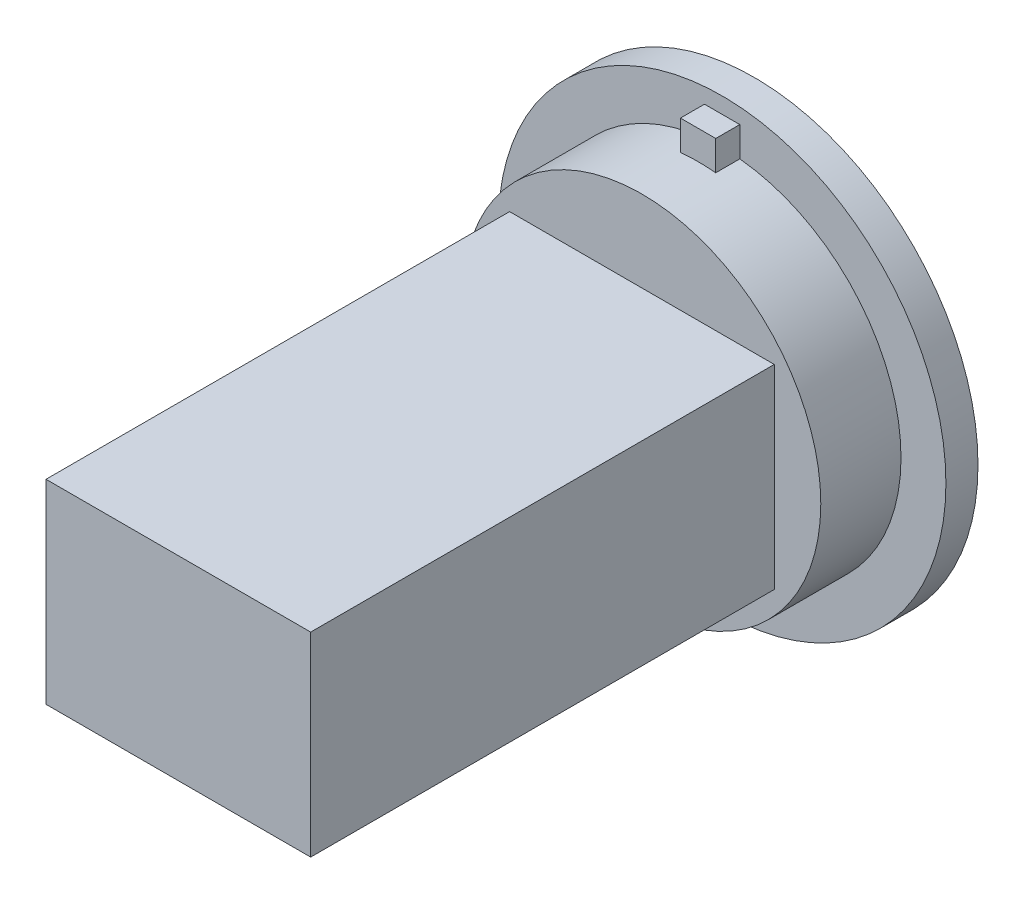
ISO-10303-21;
HEADER;
FILE_DESCRIPTION(('STEP AP214'),'2;1');
FILE_NAME('part.step','',(''),(''),'','','');
FILE_SCHEMA(('AUTOMOTIVE_DESIGN { 1 0 10303 214 1 1 1 1 }'));
ENDSEC;
DATA;
#1=APPLICATION_CONTEXT('core data for automotive mechanical design processes');
#2=APPLICATION_PROTOCOL_DEFINITION('international standard','automotive_design',2000,#1);
#3=PRODUCT_CONTEXT('',#1,'mechanical');
#4=PRODUCT('Part','Part','',(#3));
#5=PRODUCT_RELATED_PRODUCT_CATEGORY('part','',(#4));
#6=PRODUCT_DEFINITION_FORMATION('','',#4);
#7=PRODUCT_DEFINITION_CONTEXT('part definition',#1,'design');
#8=PRODUCT_DEFINITION('design','',#6,#7);
#9=PRODUCT_DEFINITION_SHAPE('','',#8);
#10=(LENGTH_UNIT() NAMED_UNIT(*) SI_UNIT(.MILLI.,.METRE.));
#11=(NAMED_UNIT(*) PLANE_ANGLE_UNIT() SI_UNIT($,.RADIAN.));
#12=(NAMED_UNIT(*) SI_UNIT($,.STERADIAN.) SOLID_ANGLE_UNIT());
#13=UNCERTAINTY_MEASURE_WITH_UNIT(LENGTH_MEASURE(1.E-05),#10,'distance_accuracy_value','');
#14=(GEOMETRIC_REPRESENTATION_CONTEXT(3) GLOBAL_UNCERTAINTY_ASSIGNED_CONTEXT((#13)) GLOBAL_UNIT_ASSIGNED_CONTEXT((#10,
#11,#12)) REPRESENTATION_CONTEXT('',''));
#15=CARTESIAN_POINT('',(0.,0.,0.));
#16=DIRECTION('',(0.,0.,1.));
#17=DIRECTION('',(1.,0.,0.));
#18=AXIS2_PLACEMENT_3D('',#15,#16,#17);
#19=CARTESIAN_POINT('',(0.,0.,2.));
#20=DIRECTION('',(0.,0.,-1.));
#21=DIRECTION('',(-1.,0.,0.));
#22=AXIS2_PLACEMENT_3D('',#19,#20,#21);
#23=CYLINDRICAL_SURFACE('',#22,13.95);
#24=CARTESIAN_POINT('',(0.,0.,2.));
#25=DIRECTION('',(0.,0.,1.));
#26=DIRECTION('',(1.,0.,0.));
#27=AXIS2_PLACEMENT_3D('',#24,#25,#26);
#28=CIRCLE('',#27,13.95);
#29=CARTESIAN_POINT('',(13.95,0.,2.));
#30=VERTEX_POINT('',#29);
#31=EDGE_CURVE('E44',#30,#30,#28,.T.);
#32=ORIENTED_EDGE('',*,*,#31,.F.);
#33=EDGE_LOOP('',(#32));
#34=FACE_BOUND('',#33,.T.);
#35=CARTESIAN_POINT('',(0.,0.,0.));
#36=DIRECTION('',(0.,0.,1.));
#37=DIRECTION('',(1.,0.,0.));
#38=AXIS2_PLACEMENT_3D('',#35,#36,#37);
#39=CIRCLE('',#38,13.95);
#40=CARTESIAN_POINT('',(13.95,0.,0.));
#41=VERTEX_POINT('',#40);
#42=EDGE_CURVE('E39',#41,#41,#39,.T.);
#43=ORIENTED_EDGE('',*,*,#42,.T.);
#44=EDGE_LOOP('',(#43));
#45=FACE_BOUND('',#44,.T.);
#46=ADVANCED_FACE('F36',(#34,#45),#23,.T.);
#47=CARTESIAN_POINT('',(0.,0.,2.));
#48=DIRECTION('',(0.,0.,1.));
#49=DIRECTION('',(1.,0.,0.));
#50=AXIS2_PLACEMENT_3D('',#47,#48,#49);
#51=PLANE('',#50);
#52=DIRECTION('',(0.,1.,0.));
#53=VECTOR('',#52,1.);
#54=CARTESIAN_POINT('',(-1.1,0.,2.));
#55=LINE('',#54,#53);
#56=CARTESIAN_POINT('',(-1.1,11.0956072389032,2.));
#57=VERTEX_POINT('',#56);
#58=CARTESIAN_POINT('',(-1.1,12.95,2.));
#59=VERTEX_POINT('',#58);
#60=EDGE_CURVE('E265',#57,#59,#55,.T.);
#61=ORIENTED_EDGE('',*,*,#60,.T.);
#62=DIRECTION('',(1.,0.,0.));
#63=VECTOR('',#62,1.);
#64=CARTESIAN_POINT('',(0.,12.95,2.));
#65=LINE('',#64,#63);
#66=CARTESIAN_POINT('',(1.1,12.95,2.));
#67=VERTEX_POINT('',#66);
#68=EDGE_CURVE('E250',#59,#67,#65,.T.);
#69=ORIENTED_EDGE('',*,*,#68,.T.);
#70=DIRECTION('',(0.,1.,0.));
#71=VECTOR('',#70,1.);
#72=CARTESIAN_POINT('',(1.1,0.,2.));
#73=LINE('',#72,#71);
#74=CARTESIAN_POINT('',(1.1,11.0956072389032,2.));
#75=VERTEX_POINT('',#74);
#76=EDGE_CURVE('E255',#75,#67,#73,.T.);
#77=ORIENTED_EDGE('',*,*,#76,.F.);
#78=CARTESIAN_POINT('',(0.,0.,2.));
#79=DIRECTION('',(0.,0.,1.));
#80=DIRECTION('',(1.,0.,0.));
#81=AXIS2_PLACEMENT_3D('',#78,#79,#80);
#82=CIRCLE('',#81,11.15);
#83=EDGE_CURVE('E11',#57,#75,#82,.T.);
#84=ORIENTED_EDGE('',*,*,#83,.F.);
#85=EDGE_LOOP('',(#61,#69,#77,#84));
#86=FACE_BOUND('',#85,.T.);
#87=ORIENTED_EDGE('',*,*,#31,.T.);
#88=EDGE_LOOP('',(#87));
#89=FACE_BOUND('',#88,.T.);
#90=ADVANCED_FACE('F290',(#86,#89),#51,.T.);
#91=CARTESIAN_POINT('',(0.,0.,0.));
#92=DIRECTION('',(0.,0.,1.));
#93=DIRECTION('',(1.,0.,0.));
#94=AXIS2_PLACEMENT_3D('',#91,#92,#93);
#95=PLANE('',#94);
#96=DIRECTION('',(1.,0.,0.));
#97=VECTOR('',#96,1.);
#98=CARTESIAN_POINT('',(-6.,4.,0.));
#99=LINE('',#98,#97);
#100=CARTESIAN_POINT('',(-6.,4.,0.));
#101=VERTEX_POINT('',#100);
#102=CARTESIAN_POINT('',(-1.5,4.,0.));
#103=VERTEX_POINT('',#102);
#104=EDGE_CURVE('E191',#101,#103,#99,.T.);
#105=ORIENTED_EDGE('',*,*,#104,.F.);
#106=DIRECTION('',(0.,1.,0.));
#107=VECTOR('',#106,1.);
#108=CARTESIAN_POINT('',(-6.,-4.,0.));
#109=LINE('',#108,#107);
#110=CARTESIAN_POINT('',(-6.,-4.,0.));
#111=VERTEX_POINT('',#110);
#112=EDGE_CURVE('E52',#111,#101,#109,.T.);
#113=ORIENTED_EDGE('',*,*,#112,.F.);
#114=DIRECTION('',(-1.,0.,0.));
#115=VECTOR('',#114,1.);
#116=CARTESIAN_POINT('',(-6.,-4.,0.));
#117=LINE('',#116,#115);
#118=CARTESIAN_POINT('',(6.,-4.,0.));
#119=VERTEX_POINT('',#118);
#120=EDGE_CURVE('E171',#119,#111,#117,.T.);
#121=ORIENTED_EDGE('',*,*,#120,.F.);
#122=DIRECTION('',(0.,-1.,0.));
#123=VECTOR('',#122,1.);
#124=CARTESIAN_POINT('',(6.,-4.,0.));
#125=LINE('',#124,#123);
#126=CARTESIAN_POINT('',(6.,4.,0.));
#127=VERTEX_POINT('',#126);
#128=EDGE_CURVE('E174',#127,#119,#125,.T.);
#129=ORIENTED_EDGE('',*,*,#128,.F.);
#130=DIRECTION('',(1.,0.,0.));
#131=VECTOR('',#130,1.);
#132=CARTESIAN_POINT('',(1.5,4.,0.));
#133=LINE('',#132,#131);
#134=CARTESIAN_POINT('',(1.5,4.,0.));
#135=VERTEX_POINT('',#134);
#136=EDGE_CURVE('E202',#135,#127,#133,.T.);
#137=ORIENTED_EDGE('',*,*,#136,.F.);
#138=DIRECTION('',(0.,-1.,0.));
#139=VECTOR('',#138,1.);
#140=CARTESIAN_POINT('',(1.5,6.,0.));
#141=LINE('',#140,#139);
#142=CARTESIAN_POINT('',(1.5,6.,0.));
#143=VERTEX_POINT('',#142);
#144=EDGE_CURVE('E199',#143,#135,#141,.T.);
#145=ORIENTED_EDGE('',*,*,#144,.F.);
#146=DIRECTION('',(1.,0.,0.));
#147=VECTOR('',#146,1.);
#148=CARTESIAN_POINT('',(-1.5,6.,0.));
#149=LINE('',#148,#147);
#150=CARTESIAN_POINT('',(-1.5,6.,0.));
#151=VERTEX_POINT('',#150);
#152=EDGE_CURVE('E196',#151,#143,#149,.T.);
#153=ORIENTED_EDGE('',*,*,#152,.F.);
#154=DIRECTION('',(0.,1.,0.));
#155=VECTOR('',#154,1.);
#156=CARTESIAN_POINT('',(-1.5,4.,0.));
#157=LINE('',#156,#155);
#158=EDGE_CURVE('E193',#103,#151,#157,.T.);
#159=ORIENTED_EDGE('',*,*,#158,.F.);
#160=EDGE_LOOP('',(#105,#113,#121,#129,#137,#145,#153,#159));
#161=FACE_BOUND('',#160,.T.);
#162=ORIENTED_EDGE('',*,*,#42,.F.);
#163=EDGE_LOOP('',(#162));
#164=FACE_BOUND('',#163,.T.);
#165=ADVANCED_FACE('F287',(#161,#164),#95,.F.);
#166=CARTESIAN_POINT('',(0.,0.,7.));
#167=DIRECTION('',(0.,0.,-1.));
#168=DIRECTION('',(-1.,0.,0.));
#169=AXIS2_PLACEMENT_3D('',#166,#167,#168);
#170=CYLINDRICAL_SURFACE('',#169,11.15);
#171=CARTESIAN_POINT('',(0.,0.,3.5));
#172=DIRECTION('',(0.,0.,1.));
#173=DIRECTION('',(1.,0.,0.));
#174=AXIS2_PLACEMENT_3D('',#171,#172,#173);
#175=CIRCLE('',#174,11.15);
#176=CARTESIAN_POINT('',(-1.1,11.0956072389032,3.5));
#177=VERTEX_POINT('',#176);
#178=CARTESIAN_POINT('',(1.1,11.0956072389032,3.5));
#179=VERTEX_POINT('',#178);
#180=EDGE_CURVE('E258',#177,#179,#175,.F.);
#181=ORIENTED_EDGE('',*,*,#180,.F.);
#182=DIRECTION('',(0.,0.,-1.));
#183=VECTOR('',#182,1.);
#184=CARTESIAN_POINT('',(-1.1,11.0956072389032,3.5));
#185=LINE('',#184,#183);
#186=EDGE_CURVE('E273',#177,#57,#185,.T.);
#187=ORIENTED_EDGE('',*,*,#186,.T.);
#188=ORIENTED_EDGE('',*,*,#83,.T.);
#189=DIRECTION('',(0.,0.,-1.));
#190=VECTOR('',#189,1.);
#191=CARTESIAN_POINT('',(1.1,11.0956072389032,3.5));
#192=LINE('',#191,#190);
#193=EDGE_CURVE('E271',#179,#75,#192,.T.);
#194=ORIENTED_EDGE('',*,*,#193,.F.);
#195=EDGE_LOOP('',(#181,#187,#188,#194));
#196=FACE_BOUND('',#195,.T.);
#197=CARTESIAN_POINT('',(0.,0.,7.));
#198=DIRECTION('',(0.,0.,1.));
#199=DIRECTION('',(1.,0.,0.));
#200=AXIS2_PLACEMENT_3D('',#197,#198,#199);
#201=CIRCLE('',#200,11.15);
#202=CARTESIAN_POINT('',(11.15,0.,7.));
#203=VERTEX_POINT('',#202);
#204=EDGE_CURVE('E278',#203,#203,#201,.T.);
#205=ORIENTED_EDGE('',*,*,#204,.F.);
#206=EDGE_LOOP('',(#205));
#207=FACE_BOUND('',#206,.T.);
#208=ADVANCED_FACE('F289',(#196,#207),#170,.T.);
#209=CARTESIAN_POINT('',(0.,0.,7.));
#210=DIRECTION('',(0.,0.,1.));
#211=DIRECTION('',(1.,0.,0.));
#212=AXIS2_PLACEMENT_3D('',#209,#210,#211);
#213=PLANE('',#212);
#214=DIRECTION('',(0.,-1.,0.));
#215=VECTOR('',#214,1.);
#216=CARTESIAN_POINT('',(-8.25,6.075,7.));
#217=LINE('',#216,#215);
#218=CARTESIAN_POINT('',(-8.25,6.075,7.));
#219=VERTEX_POINT('',#218);
#220=CARTESIAN_POINT('',(-8.25,-6.075,7.));
#221=VERTEX_POINT('',#220);
#222=EDGE_CURVE('E60',#219,#221,#217,.T.);
#223=ORIENTED_EDGE('',*,*,#222,.F.);
#224=DIRECTION('',(-1.,0.,0.));
#225=VECTOR('',#224,1.);
#226=CARTESIAN_POINT('',(-8.25,6.075,7.));
#227=LINE('',#226,#225);
#228=CARTESIAN_POINT('',(8.25,6.075,7.));
#229=VERTEX_POINT('',#228);
#230=EDGE_CURVE('E224',#229,#219,#227,.T.);
#231=ORIENTED_EDGE('',*,*,#230,.F.);
#232=DIRECTION('',(0.,1.,0.));
#233=VECTOR('',#232,1.);
#234=CARTESIAN_POINT('',(8.25,6.075,7.));
#235=LINE('',#234,#233);
#236=CARTESIAN_POINT('',(8.25,-6.075,7.));
#237=VERTEX_POINT('',#236);
#238=EDGE_CURVE('E235',#237,#229,#235,.T.);
#239=ORIENTED_EDGE('',*,*,#238,.F.);
#240=DIRECTION('',(1.,0.,0.));
#241=VECTOR('',#240,1.);
#242=CARTESIAN_POINT('',(-8.25,-6.075,7.));
#243=LINE('',#242,#241);
#244=EDGE_CURVE('E232',#221,#237,#243,.T.);
#245=ORIENTED_EDGE('',*,*,#244,.F.);
#246=EDGE_LOOP('',(#223,#231,#239,#245));
#247=FACE_BOUND('',#246,.T.);
#248=ORIENTED_EDGE('',*,*,#204,.T.);
#249=EDGE_LOOP('',(#248));
#250=FACE_BOUND('',#249,.T.);
#251=ADVANCED_FACE('F296',(#247,#250),#213,.T.);
#252=CARTESIAN_POINT('',(0.,12.95,3.5));
#253=DIRECTION('',(0.,1.,0.));
#254=DIRECTION('',(0.,0.,1.));
#255=AXIS2_PLACEMENT_3D('',#252,#253,#254);
#256=PLANE('',#255);
#257=ORIENTED_EDGE('',*,*,#68,.F.);
#258=DIRECTION('',(0.,0.,-1.));
#259=VECTOR('',#258,1.);
#260=CARTESIAN_POINT('',(-1.1,12.95,3.5));
#261=LINE('',#260,#259);
#262=CARTESIAN_POINT('',(-1.1,12.95,3.5));
#263=VERTEX_POINT('',#262);
#264=EDGE_CURVE('E276',#263,#59,#261,.T.);
#265=ORIENTED_EDGE('',*,*,#264,.F.);
#266=DIRECTION('',(1.,0.,0.));
#267=VECTOR('',#266,1.);
#268=CARTESIAN_POINT('',(0.,12.95,3.5));
#269=LINE('',#268,#267);
#270=CARTESIAN_POINT('',(1.1,12.95,3.5));
#271=VERTEX_POINT('',#270);
#272=EDGE_CURVE('E251',#263,#271,#269,.T.);
#273=ORIENTED_EDGE('',*,*,#272,.T.);
#274=DIRECTION('',(0.,0.,-1.));
#275=VECTOR('',#274,1.);
#276=CARTESIAN_POINT('',(1.1,12.95,3.5));
#277=LINE('',#276,#275);
#278=EDGE_CURVE('E262',#271,#67,#277,.T.);
#279=ORIENTED_EDGE('',*,*,#278,.T.);
#280=EDGE_LOOP('',(#257,#265,#273,#279));
#281=FACE_BOUND('',#280,.T.);
#282=ADVANCED_FACE('F323',(#281),#256,.T.);
#283=CARTESIAN_POINT('',(-1.1,0.,3.5));
#284=DIRECTION('',(-1.,0.,0.));
#285=DIRECTION('',(0.,0.,1.));
#286=AXIS2_PLACEMENT_3D('',#283,#284,#285);
#287=PLANE('',#286);
#288=ORIENTED_EDGE('',*,*,#60,.F.);
#289=ORIENTED_EDGE('',*,*,#186,.F.);
#290=DIRECTION('',(0.,1.,0.));
#291=VECTOR('',#290,1.);
#292=CARTESIAN_POINT('',(-1.1,0.,3.5));
#293=LINE('',#292,#291);
#294=EDGE_CURVE('E254',#177,#263,#293,.T.);
#295=ORIENTED_EDGE('',*,*,#294,.T.);
#296=ORIENTED_EDGE('',*,*,#264,.T.);
#297=EDGE_LOOP('',(#288,#289,#295,#296));
#298=FACE_BOUND('',#297,.T.);
#299=ADVANCED_FACE('F328',(#298),#287,.T.);
#300=CARTESIAN_POINT('',(1.1,0.,3.5));
#301=DIRECTION('',(-1.,0.,0.));
#302=DIRECTION('',(0.,0.,1.));
#303=AXIS2_PLACEMENT_3D('',#300,#301,#302);
#304=PLANE('',#303);
#305=ORIENTED_EDGE('',*,*,#76,.T.);
#306=ORIENTED_EDGE('',*,*,#278,.F.);
#307=DIRECTION('',(0.,1.,0.));
#308=VECTOR('',#307,1.);
#309=CARTESIAN_POINT('',(1.1,0.,3.5));
#310=LINE('',#309,#308);
#311=EDGE_CURVE('E260',#179,#271,#310,.T.);
#312=ORIENTED_EDGE('',*,*,#311,.F.);
#313=ORIENTED_EDGE('',*,*,#193,.T.);
#314=EDGE_LOOP('',(#305,#306,#312,#313));
#315=FACE_BOUND('',#314,.T.);
#316=ADVANCED_FACE('F338',(#315),#304,.F.);
#317=CARTESIAN_POINT('',(0.,0.,3.5));
#318=DIRECTION('',(0.,0.,1.));
#319=DIRECTION('',(1.,0.,0.));
#320=AXIS2_PLACEMENT_3D('',#317,#318,#319);
#321=PLANE('',#320);
#322=ORIENTED_EDGE('',*,*,#272,.F.);
#323=ORIENTED_EDGE('',*,*,#294,.F.);
#324=ORIENTED_EDGE('',*,*,#180,.T.);
#325=ORIENTED_EDGE('',*,*,#311,.T.);
#326=EDGE_LOOP('',(#322,#323,#324,#325));
#327=FACE_BOUND('',#326,.T.);
#328=ADVANCED_FACE('F348',(#327),#321,.T.);
#329=CARTESIAN_POINT('',(-8.25,6.075,35.9));
#330=DIRECTION('',(1.,0.,0.));
#331=DIRECTION('',(0.,0.,-1.));
#332=AXIS2_PLACEMENT_3D('',#329,#330,#331);
#333=PLANE('',#332);
#334=ORIENTED_EDGE('',*,*,#222,.T.);
#335=DIRECTION('',(0.,0.,-1.));
#336=VECTOR('',#335,1.);
#337=CARTESIAN_POINT('',(-8.25,-6.075,35.9));
#338=LINE('',#337,#336);
#339=CARTESIAN_POINT('',(-8.25,-6.075,35.9));
#340=VERTEX_POINT('',#339);
#341=EDGE_CURVE('E247',#340,#221,#338,.T.);
#342=ORIENTED_EDGE('',*,*,#341,.F.);
#343=DIRECTION('',(0.,-1.,0.));
#344=VECTOR('',#343,1.);
#345=CARTESIAN_POINT('',(-8.25,6.075,35.9));
#346=LINE('',#345,#344);
#347=CARTESIAN_POINT('',(-8.25,6.075,35.9));
#348=VERTEX_POINT('',#347);
#349=EDGE_CURVE('E220',#348,#340,#346,.T.);
#350=ORIENTED_EDGE('',*,*,#349,.F.);
#351=DIRECTION('',(0.,0.,-1.));
#352=VECTOR('',#351,1.);
#353=CARTESIAN_POINT('',(-8.25,6.075,35.9));
#354=LINE('',#353,#352);
#355=EDGE_CURVE('E230',#348,#219,#354,.T.);
#356=ORIENTED_EDGE('',*,*,#355,.T.);
#357=EDGE_LOOP('',(#334,#342,#350,#356));
#358=FACE_BOUND('',#357,.T.);
#359=ADVANCED_FACE('F358',(#358),#333,.F.);
#360=CARTESIAN_POINT('',(-8.25,-6.075,35.9));
#361=DIRECTION('',(0.,1.,0.));
#362=DIRECTION('',(0.,0.,1.));
#363=AXIS2_PLACEMENT_3D('',#360,#361,#362);
#364=PLANE('',#363);
#365=ORIENTED_EDGE('',*,*,#244,.T.);
#366=DIRECTION('',(0.,0.,-1.));
#367=VECTOR('',#366,1.);
#368=CARTESIAN_POINT('',(8.25,-6.075,35.9));
#369=LINE('',#368,#367);
#370=CARTESIAN_POINT('',(8.25,-6.075,35.9));
#371=VERTEX_POINT('',#370);
#372=EDGE_CURVE('E244',#371,#237,#369,.T.);
#373=ORIENTED_EDGE('',*,*,#372,.F.);
#374=DIRECTION('',(1.,0.,0.));
#375=VECTOR('',#374,1.);
#376=CARTESIAN_POINT('',(-8.25,-6.075,35.9));
#377=LINE('',#376,#375);
#378=EDGE_CURVE('E223',#340,#371,#377,.T.);
#379=ORIENTED_EDGE('',*,*,#378,.F.);
#380=ORIENTED_EDGE('',*,*,#341,.T.);
#381=EDGE_LOOP('',(#365,#373,#379,#380));
#382=FACE_BOUND('',#381,.T.);
#383=ADVANCED_FACE('F374',(#382),#364,.F.);
#384=CARTESIAN_POINT('',(8.25,6.075,35.9));
#385=DIRECTION('',(-1.,0.,0.));
#386=DIRECTION('',(0.,0.,1.));
#387=AXIS2_PLACEMENT_3D('',#384,#385,#386);
#388=PLANE('',#387);
#389=ORIENTED_EDGE('',*,*,#238,.T.);
#390=DIRECTION('',(0.,0.,-1.));
#391=VECTOR('',#390,1.);
#392=CARTESIAN_POINT('',(8.25,6.075,35.9));
#393=LINE('',#392,#391);
#394=CARTESIAN_POINT('',(8.25,6.075,35.9));
#395=VERTEX_POINT('',#394);
#396=EDGE_CURVE('E241',#395,#229,#393,.T.);
#397=ORIENTED_EDGE('',*,*,#396,.F.);
#398=DIRECTION('',(0.,1.,0.));
#399=VECTOR('',#398,1.);
#400=CARTESIAN_POINT('',(8.25,6.075,35.9));
#401=LINE('',#400,#399);
#402=EDGE_CURVE('E226',#371,#395,#401,.T.);
#403=ORIENTED_EDGE('',*,*,#402,.F.);
#404=ORIENTED_EDGE('',*,*,#372,.T.);
#405=EDGE_LOOP('',(#389,#397,#403,#404));
#406=FACE_BOUND('',#405,.T.);
#407=ADVANCED_FACE('F384',(#406),#388,.F.);
#408=CARTESIAN_POINT('',(-8.25,6.075,35.9));
#409=DIRECTION('',(0.,-1.,0.));
#410=DIRECTION('',(0.,0.,-1.));
#411=AXIS2_PLACEMENT_3D('',#408,#409,#410);
#412=PLANE('',#411);
#413=ORIENTED_EDGE('',*,*,#230,.T.);
#414=ORIENTED_EDGE('',*,*,#355,.F.);
#415=DIRECTION('',(-1.,0.,0.));
#416=VECTOR('',#415,1.);
#417=CARTESIAN_POINT('',(-8.25,6.075,35.9));
#418=LINE('',#417,#416);
#419=EDGE_CURVE('E228',#395,#348,#418,.T.);
#420=ORIENTED_EDGE('',*,*,#419,.F.);
#421=ORIENTED_EDGE('',*,*,#396,.T.);
#422=EDGE_LOOP('',(#413,#414,#420,#421));
#423=FACE_BOUND('',#422,.T.);
#424=ADVANCED_FACE('F394',(#423),#412,.F.);
#425=CARTESIAN_POINT('',(0.,0.,35.9));
#426=DIRECTION('',(0.,0.,1.));
#427=DIRECTION('',(1.,0.,0.));
#428=AXIS2_PLACEMENT_3D('',#425,#426,#427);
#429=PLANE('',#428);
#430=ORIENTED_EDGE('',*,*,#349,.T.);
#431=ORIENTED_EDGE('',*,*,#378,.T.);
#432=ORIENTED_EDGE('',*,*,#402,.T.);
#433=ORIENTED_EDGE('',*,*,#419,.T.);
#434=EDGE_LOOP('',(#430,#431,#432,#433));
#435=FACE_BOUND('',#434,.T.);
#436=ADVANCED_FACE('F404',(#435),#429,.T.);
#437=CARTESIAN_POINT('',(-6.,-4.,10.));
#438=DIRECTION('',(-1.,0.,0.));
#439=DIRECTION('',(0.,0.,1.));
#440=AXIS2_PLACEMENT_3D('',#437,#438,#439);
#441=PLANE('',#440);
#442=ORIENTED_EDGE('',*,*,#112,.T.);
#443=DIRECTION('',(0.,0.,-1.));
#444=VECTOR('',#443,1.);
#445=CARTESIAN_POINT('',(-6.,4.,10.));
#446=LINE('',#445,#444);
#447=CARTESIAN_POINT('',(-6.,4.,10.));
#448=VERTEX_POINT('',#447);
#449=EDGE_CURVE('E148',#448,#101,#446,.T.);
#450=ORIENTED_EDGE('',*,*,#449,.F.);
#451=DIRECTION('',(0.,1.,0.));
#452=VECTOR('',#451,1.);
#453=CARTESIAN_POINT('',(-6.,-4.,10.));
#454=LINE('',#453,#452);
#455=CARTESIAN_POINT('',(-6.,-4.,10.));
#456=VERTEX_POINT('',#455);
#457=EDGE_CURVE('E152',#456,#448,#454,.T.);
#458=ORIENTED_EDGE('',*,*,#457,.F.);
#459=DIRECTION('',(0.,0.,-1.));
#460=VECTOR('',#459,1.);
#461=CARTESIAN_POINT('',(-6.,-4.,10.));
#462=LINE('',#461,#460);
#463=EDGE_CURVE('E207',#456,#111,#462,.T.);
#464=ORIENTED_EDGE('',*,*,#463,.T.);
#465=EDGE_LOOP('',(#442,#450,#458,#464));
#466=FACE_BOUND('',#465,.T.);
#467=ADVANCED_FACE('F150',(#466),#441,.F.);
#468=CARTESIAN_POINT('',(-6.,-4.,10.));
#469=DIRECTION('',(0.,-1.,0.));
#470=DIRECTION('',(0.,0.,-1.));
#471=AXIS2_PLACEMENT_3D('',#468,#469,#470);
#472=PLANE('',#471);
#473=ORIENTED_EDGE('',*,*,#120,.T.);
#474=ORIENTED_EDGE('',*,*,#463,.F.);
#475=DIRECTION('',(-1.,0.,0.));
#476=VECTOR('',#475,1.);
#477=CARTESIAN_POINT('',(-6.,-4.,10.));
#478=LINE('',#477,#476);
#479=CARTESIAN_POINT('',(6.,-4.,10.));
#480=VERTEX_POINT('',#479);
#481=EDGE_CURVE('E158',#480,#456,#478,.T.);
#482=ORIENTED_EDGE('',*,*,#481,.F.);
#483=DIRECTION('',(0.,0.,-1.));
#484=VECTOR('',#483,1.);
#485=CARTESIAN_POINT('',(6.,-4.,10.));
#486=LINE('',#485,#484);
#487=EDGE_CURVE('E209',#480,#119,#486,.T.);
#488=ORIENTED_EDGE('',*,*,#487,.T.);
#489=EDGE_LOOP('',(#473,#474,#482,#488));
#490=FACE_BOUND('',#489,.T.);
#491=ADVANCED_FACE('F426',(#490),#472,.F.);
#492=CARTESIAN_POINT('',(6.,-4.,10.));
#493=DIRECTION('',(1.,0.,0.));
#494=DIRECTION('',(0.,0.,-1.));
#495=AXIS2_PLACEMENT_3D('',#492,#493,#494);
#496=PLANE('',#495);
#497=ORIENTED_EDGE('',*,*,#128,.T.);
#498=ORIENTED_EDGE('',*,*,#487,.F.);
#499=DIRECTION('',(0.,-1.,0.));
#500=VECTOR('',#499,1.);
#501=CARTESIAN_POINT('',(6.,-4.,10.));
#502=LINE('',#501,#500);
#503=CARTESIAN_POINT('',(6.,4.,10.));
#504=VERTEX_POINT('',#503);
#505=EDGE_CURVE('E187',#504,#480,#502,.T.);
#506=ORIENTED_EDGE('',*,*,#505,.F.);
#507=DIRECTION('',(0.,0.,-1.));
#508=VECTOR('',#507,1.);
#509=CARTESIAN_POINT('',(6.,4.,10.));
#510=LINE('',#509,#508);
#511=EDGE_CURVE('E211',#504,#127,#510,.T.);
#512=ORIENTED_EDGE('',*,*,#511,.T.);
#513=EDGE_LOOP('',(#497,#498,#506,#512));
#514=FACE_BOUND('',#513,.T.);
#515=ADVANCED_FACE('F435',(#514),#496,.F.);
#516=CARTESIAN_POINT('',(1.5,4.,10.));
#517=DIRECTION('',(0.,1.,0.));
#518=DIRECTION('',(0.,0.,1.));
#519=AXIS2_PLACEMENT_3D('',#516,#517,#518);
#520=PLANE('',#519);
#521=ORIENTED_EDGE('',*,*,#136,.T.);
#522=ORIENTED_EDGE('',*,*,#511,.F.);
#523=DIRECTION('',(1.,0.,0.));
#524=VECTOR('',#523,1.);
#525=CARTESIAN_POINT('',(1.5,4.,10.));
#526=LINE('',#525,#524);
#527=CARTESIAN_POINT('',(1.5,4.,10.));
#528=VERTEX_POINT('',#527);
#529=EDGE_CURVE('E184',#528,#504,#526,.T.);
#530=ORIENTED_EDGE('',*,*,#529,.F.);
#531=DIRECTION('',(0.,0.,-1.));
#532=VECTOR('',#531,1.);
#533=CARTESIAN_POINT('',(1.5,4.,10.));
#534=LINE('',#533,#532);
#535=EDGE_CURVE('E213',#528,#135,#534,.T.);
#536=ORIENTED_EDGE('',*,*,#535,.T.);
#537=EDGE_LOOP('',(#521,#522,#530,#536));
#538=FACE_BOUND('',#537,.T.);
#539=ADVANCED_FACE('F445',(#538),#520,.F.);
#540=CARTESIAN_POINT('',(1.5,6.,10.));
#541=DIRECTION('',(1.,0.,0.));
#542=DIRECTION('',(0.,0.,-1.));
#543=AXIS2_PLACEMENT_3D('',#540,#541,#542);
#544=PLANE('',#543);
#545=ORIENTED_EDGE('',*,*,#144,.T.);
#546=ORIENTED_EDGE('',*,*,#535,.F.);
#547=DIRECTION('',(0.,-1.,0.));
#548=VECTOR('',#547,1.);
#549=CARTESIAN_POINT('',(1.5,6.,10.));
#550=LINE('',#549,#548);
#551=CARTESIAN_POINT('',(1.5,6.,10.));
#552=VERTEX_POINT('',#551);
#553=EDGE_CURVE('E181',#552,#528,#550,.T.);
#554=ORIENTED_EDGE('',*,*,#553,.F.);
#555=DIRECTION('',(0.,0.,-1.));
#556=VECTOR('',#555,1.);
#557=CARTESIAN_POINT('',(1.5,6.,10.));
#558=LINE('',#557,#556);
#559=EDGE_CURVE('E215',#552,#143,#558,.T.);
#560=ORIENTED_EDGE('',*,*,#559,.T.);
#561=EDGE_LOOP('',(#545,#546,#554,#560));
#562=FACE_BOUND('',#561,.T.);
#563=ADVANCED_FACE('F455',(#562),#544,.F.);
#564=CARTESIAN_POINT('',(-1.5,6.,10.));
#565=DIRECTION('',(0.,1.,0.));
#566=DIRECTION('',(-1.,0.,0.));
#567=AXIS2_PLACEMENT_3D('',#564,#565,#566);
#568=PLANE('',#567);
#569=ORIENTED_EDGE('',*,*,#152,.T.);
#570=ORIENTED_EDGE('',*,*,#559,.F.);
#571=DIRECTION('',(1.,0.,0.));
#572=VECTOR('',#571,1.);
#573=CARTESIAN_POINT('',(-1.5,6.,10.));
#574=LINE('',#573,#572);
#575=CARTESIAN_POINT('',(-1.5,6.,10.));
#576=VERTEX_POINT('',#575);
#577=EDGE_CURVE('E178',#576,#552,#574,.T.);
#578=ORIENTED_EDGE('',*,*,#577,.F.);
#579=DIRECTION('',(0.,0.,-1.));
#580=VECTOR('',#579,1.);
#581=CARTESIAN_POINT('',(-1.5,6.,10.));
#582=LINE('',#581,#580);
#583=EDGE_CURVE('E217',#576,#151,#582,.T.);
#584=ORIENTED_EDGE('',*,*,#583,.T.);
#585=EDGE_LOOP('',(#569,#570,#578,#584));
#586=FACE_BOUND('',#585,.T.);
#587=ADVANCED_FACE('F465',(#586),#568,.F.);
#588=CARTESIAN_POINT('',(-1.5,4.,10.));
#589=DIRECTION('',(-1.,0.,0.));
#590=DIRECTION('',(0.,0.,1.));
#591=AXIS2_PLACEMENT_3D('',#588,#589,#590);
#592=PLANE('',#591);
#593=ORIENTED_EDGE('',*,*,#158,.T.);
#594=ORIENTED_EDGE('',*,*,#583,.F.);
#595=DIRECTION('',(0.,1.,0.));
#596=VECTOR('',#595,1.);
#597=CARTESIAN_POINT('',(-1.5,4.,10.));
#598=LINE('',#597,#596);
#599=CARTESIAN_POINT('',(-1.5,4.,10.));
#600=VERTEX_POINT('',#599);
#601=EDGE_CURVE('E166',#600,#576,#598,.T.);
#602=ORIENTED_EDGE('',*,*,#601,.F.);
#603=DIRECTION('',(0.,0.,-1.));
#604=VECTOR('',#603,1.);
#605=CARTESIAN_POINT('',(-1.5,4.,10.));
#606=LINE('',#605,#604);
#607=EDGE_CURVE('E157',#600,#103,#606,.T.);
#608=ORIENTED_EDGE('',*,*,#607,.T.);
#609=EDGE_LOOP('',(#593,#594,#602,#608));
#610=FACE_BOUND('',#609,.T.);
#611=ADVANCED_FACE('F475',(#610),#592,.F.);
#612=CARTESIAN_POINT('',(-6.,4.,10.));
#613=DIRECTION('',(0.,1.,0.));
#614=DIRECTION('',(0.,0.,1.));
#615=AXIS2_PLACEMENT_3D('',#612,#613,#614);
#616=PLANE('',#615);
#617=ORIENTED_EDGE('',*,*,#104,.T.);
#618=ORIENTED_EDGE('',*,*,#607,.F.);
#619=DIRECTION('',(1.,0.,0.));
#620=VECTOR('',#619,1.);
#621=CARTESIAN_POINT('',(-6.,4.,10.));
#622=LINE('',#621,#620);
#623=EDGE_CURVE('E161',#448,#600,#622,.T.);
#624=ORIENTED_EDGE('',*,*,#623,.F.);
#625=ORIENTED_EDGE('',*,*,#449,.T.);
#626=EDGE_LOOP('',(#617,#618,#624,#625));
#627=FACE_BOUND('',#626,.T.);
#628=ADVANCED_FACE('F162',(#627),#616,.F.);
#629=CARTESIAN_POINT('',(0.,0.,10.));
#630=DIRECTION('',(0.,0.,-1.));
#631=DIRECTION('',(-1.,0.,0.));
#632=AXIS2_PLACEMENT_3D('',#629,#630,#631);
#633=PLANE('',#632);
#634=ORIENTED_EDGE('',*,*,#457,.T.);
#635=ORIENTED_EDGE('',*,*,#623,.T.);
#636=ORIENTED_EDGE('',*,*,#601,.T.);
#637=ORIENTED_EDGE('',*,*,#577,.T.);
#638=ORIENTED_EDGE('',*,*,#553,.T.);
#639=ORIENTED_EDGE('',*,*,#529,.T.);
#640=ORIENTED_EDGE('',*,*,#505,.T.);
#641=ORIENTED_EDGE('',*,*,#481,.T.);
#642=EDGE_LOOP('',(#634,#635,#636,#637,#638,#639,#640,#641));
#643=FACE_BOUND('',#642,.T.);
#644=ADVANCED_FACE('F168',(#643),#633,.T.);
#645=CLOSED_SHELL('',(#46,#90,#165,#208,#251,#282,#299,#316,#328,#359,#383,#407,#424,#436,#467,
#491,#515,#539,#563,#587,#611,#628,#644));
#646=MANIFOLD_SOLID_BREP('B2',#645);
#647=ADVANCED_BREP_SHAPE_REPRESENTATION('',(#18,#646),#14);
#648=SHAPE_DEFINITION_REPRESENTATION(#9,#647);
ENDSEC;
END-ISO-10303-21;
